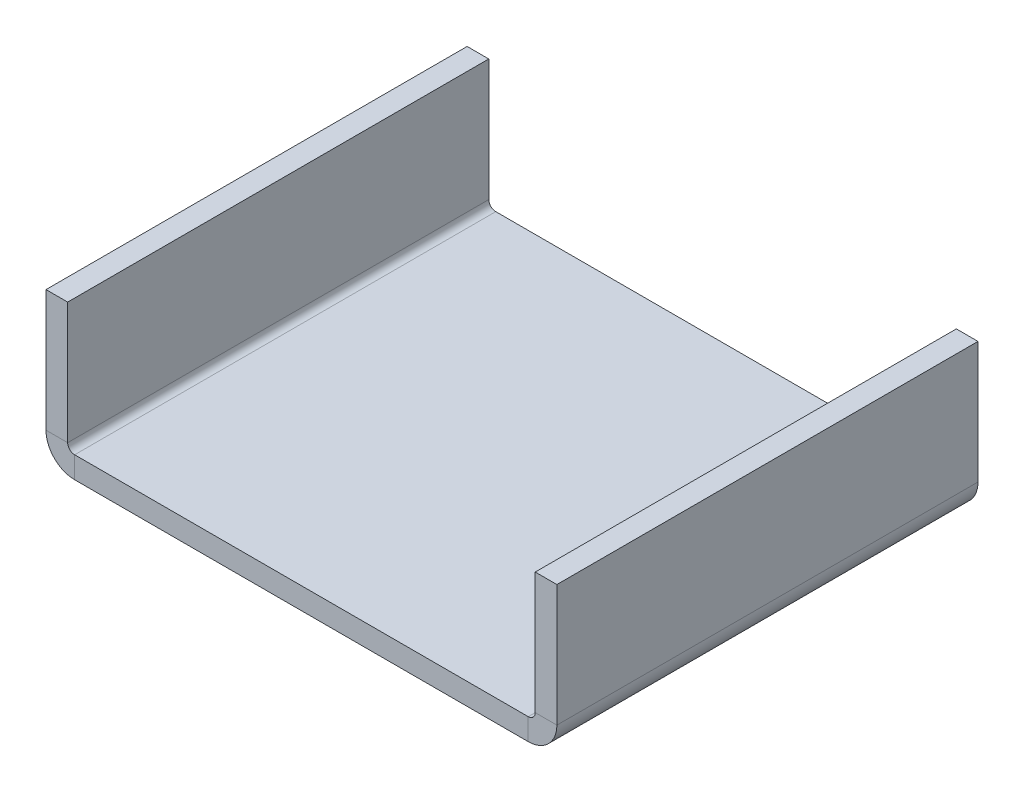
ISO-10303-21;
HEADER;
FILE_DESCRIPTION(('STEP AP214'),'2;1');
FILE_NAME('part.step','',(''),(''),'','','');
FILE_SCHEMA(('AUTOMOTIVE_DESIGN { 1 0 10303 214 1 1 1 1 }'));
ENDSEC;
DATA;
#1=APPLICATION_CONTEXT('core data for automotive mechanical design processes');
#2=APPLICATION_PROTOCOL_DEFINITION('international standard','automotive_design',2000,#1);
#3=PRODUCT_CONTEXT('',#1,'mechanical');
#4=PRODUCT('Part','Part','',(#3));
#5=PRODUCT_RELATED_PRODUCT_CATEGORY('part','',(#4));
#6=PRODUCT_DEFINITION_FORMATION('','',#4);
#7=PRODUCT_DEFINITION_CONTEXT('part definition',#1,'design');
#8=PRODUCT_DEFINITION('design','',#6,#7);
#9=PRODUCT_DEFINITION_SHAPE('','',#8);
#10=(LENGTH_UNIT() NAMED_UNIT(*) SI_UNIT(.MILLI.,.METRE.));
#11=(NAMED_UNIT(*) PLANE_ANGLE_UNIT() SI_UNIT($,.RADIAN.));
#12=(NAMED_UNIT(*) SI_UNIT($,.STERADIAN.) SOLID_ANGLE_UNIT());
#13=UNCERTAINTY_MEASURE_WITH_UNIT(LENGTH_MEASURE(1.E-05),#10,'distance_accuracy_value','');
#14=(GEOMETRIC_REPRESENTATION_CONTEXT(3) GLOBAL_UNCERTAINTY_ASSIGNED_CONTEXT((#13)) GLOBAL_UNIT_ASSIGNED_CONTEXT((#10,
#11,#12)) REPRESENTATION_CONTEXT('',''));
#15=CARTESIAN_POINT('',(0.,0.,0.));
#16=DIRECTION('',(0.,0.,1.));
#17=DIRECTION('',(1.,0.,0.));
#18=AXIS2_PLACEMENT_3D('',#15,#16,#17);
#19=CARTESIAN_POINT('',(0.,-2.286,0.));
#20=DIRECTION('',(0.,-1.,0.));
#21=DIRECTION('',(0.,0.,-1.));
#22=AXIS2_PLACEMENT_3D('',#19,#20,#21);
#23=PLANE('',#22);
#24=DIRECTION('',(-1.,0.,0.));
#25=VECTOR('',#24,1.);
#26=CARTESIAN_POINT('',(-26.9621,-2.286,-22.225));
#27=LINE('',#26,#25);
#28=CARTESIAN_POINT('',(23.9395,-2.286,-22.225));
#29=VERTEX_POINT('',#28);
#30=CARTESIAN_POINT('',(-23.9395,-2.286,-22.225));
#31=VERTEX_POINT('',#30);
#32=EDGE_CURVE('E90',#29,#31,#27,.T.);
#33=ORIENTED_EDGE('',*,*,#32,.F.);
#34=DIRECTION('',(0.,0.,-1.));
#35=VECTOR('',#34,1.);
#36=CARTESIAN_POINT('',(23.9395,-2.286,-22.225));
#37=LINE('',#36,#35);
#38=CARTESIAN_POINT('',(23.9395,-2.286,22.225));
#39=VERTEX_POINT('',#38);
#40=EDGE_CURVE('E213',#29,#39,#37,.F.);
#41=ORIENTED_EDGE('',*,*,#40,.T.);
#42=DIRECTION('',(1.,0.,0.));
#43=VECTOR('',#42,1.);
#44=CARTESIAN_POINT('',(-26.9621,-2.286,22.225));
#45=LINE('',#44,#43);
#46=CARTESIAN_POINT('',(-23.9395,-2.286,22.225));
#47=VERTEX_POINT('',#46);
#48=EDGE_CURVE('E13',#47,#39,#45,.T.);
#49=ORIENTED_EDGE('',*,*,#48,.F.);
#50=DIRECTION('',(0.,0.,1.));
#51=VECTOR('',#50,1.);
#52=CARTESIAN_POINT('',(-23.9395,-2.286,22.225));
#53=LINE('',#52,#51);
#54=EDGE_CURVE('E264',#47,#31,#53,.F.);
#55=ORIENTED_EDGE('',*,*,#54,.T.);
#56=EDGE_LOOP('',(#33,#41,#49,#55));
#57=FACE_BOUND('',#56,.T.);
#58=ADVANCED_FACE('F81',(#57),#23,.T.);
#59=CARTESIAN_POINT('',(0.,0.,0.));
#60=DIRECTION('',(0.,-1.,0.));
#61=DIRECTION('',(0.,0.,-1.));
#62=AXIS2_PLACEMENT_3D('',#59,#60,#61);
#63=PLANE('',#62);
#64=DIRECTION('',(0.,0.,-1.));
#65=VECTOR('',#64,1.);
#66=CARTESIAN_POINT('',(23.9395,0.,-22.225));
#67=LINE('',#66,#65);
#68=CARTESIAN_POINT('',(23.9395,0.,-22.225));
#69=VERTEX_POINT('',#68);
#70=CARTESIAN_POINT('',(23.9395,0.,22.225));
#71=VERTEX_POINT('',#70);
#72=EDGE_CURVE('E224',#69,#71,#67,.F.);
#73=ORIENTED_EDGE('',*,*,#72,.F.);
#74=DIRECTION('',(-1.,0.,0.));
#75=VECTOR('',#74,1.);
#76=CARTESIAN_POINT('',(-26.9621,0.,-22.225));
#77=LINE('',#76,#75);
#78=CARTESIAN_POINT('',(-23.9395,0.,-22.225));
#79=VERTEX_POINT('',#78);
#80=EDGE_CURVE('E281',#69,#79,#77,.T.);
#81=ORIENTED_EDGE('',*,*,#80,.T.);
#82=DIRECTION('',(0.,0.,1.));
#83=VECTOR('',#82,1.);
#84=CARTESIAN_POINT('',(-23.9395,0.,22.225));
#85=LINE('',#84,#83);
#86=CARTESIAN_POINT('',(-23.9395,0.,22.225));
#87=VERTEX_POINT('',#86);
#88=EDGE_CURVE('E275',#87,#79,#85,.F.);
#89=ORIENTED_EDGE('',*,*,#88,.F.);
#90=DIRECTION('',(1.,0.,0.));
#91=VECTOR('',#90,1.);
#92=CARTESIAN_POINT('',(-26.9621,0.,22.225));
#93=LINE('',#92,#91);
#94=EDGE_CURVE('E85',#87,#71,#93,.T.);
#95=ORIENTED_EDGE('',*,*,#94,.T.);
#96=EDGE_LOOP('',(#73,#81,#89,#95));
#97=FACE_BOUND('',#96,.T.);
#98=ADVANCED_FACE('F293',(#97),#63,.F.);
#99=CARTESIAN_POINT('',(-26.9621,-2.286,-22.225));
#100=DIRECTION('',(0.,0.,-1.));
#101=DIRECTION('',(-1.,0.,0.));
#102=AXIS2_PLACEMENT_3D('',#99,#100,#101);
#103=PLANE('',#102);
#104=ORIENTED_EDGE('',*,*,#80,.F.);
#105=DIRECTION('',(0.,-1.,0.));
#106=VECTOR('',#105,1.);
#107=CARTESIAN_POINT('',(23.9395,0.,-22.225));
#108=LINE('',#107,#106);
#109=EDGE_CURVE('E218',#69,#29,#108,.T.);
#110=ORIENTED_EDGE('',*,*,#109,.T.);
#111=ORIENTED_EDGE('',*,*,#32,.T.);
#112=DIRECTION('',(0.,-1.,0.));
#113=VECTOR('',#112,1.);
#114=CARTESIAN_POINT('',(-23.9395,0.,-22.225));
#115=LINE('',#114,#113);
#116=EDGE_CURVE('E279',#79,#31,#115,.T.);
#117=ORIENTED_EDGE('',*,*,#116,.F.);
#118=EDGE_LOOP('',(#104,#110,#111,#117));
#119=FACE_BOUND('',#118,.T.);
#120=ADVANCED_FACE('F83',(#119),#103,.T.);
#121=CARTESIAN_POINT('',(-26.9621,-2.286,22.225));
#122=DIRECTION('',(0.,0.,1.));
#123=DIRECTION('',(1.,0.,0.));
#124=AXIS2_PLACEMENT_3D('',#121,#122,#123);
#125=PLANE('',#124);
#126=DIRECTION('',(0.,-1.,0.));
#127=VECTOR('',#126,1.);
#128=CARTESIAN_POINT('',(23.9395,0.,22.225));
#129=LINE('',#128,#127);
#130=EDGE_CURVE('E229',#71,#39,#129,.T.);
#131=ORIENTED_EDGE('',*,*,#130,.F.);
#132=ORIENTED_EDGE('',*,*,#94,.F.);
#133=DIRECTION('',(0.,-1.,0.));
#134=VECTOR('',#133,1.);
#135=CARTESIAN_POINT('',(-23.9395,0.,22.225));
#136=LINE('',#135,#134);
#137=EDGE_CURVE('E269',#87,#47,#136,.T.);
#138=ORIENTED_EDGE('',*,*,#137,.T.);
#139=ORIENTED_EDGE('',*,*,#48,.T.);
#140=EDGE_LOOP('',(#131,#132,#138,#139));
#141=FACE_BOUND('',#140,.T.);
#142=ADVANCED_FACE('F296',(#141),#125,.T.);
#143=CARTESIAN_POINT('',(-23.9395,0.7366,-22.225));
#144=DIRECTION('',(0.,0.,-1.));
#145=DIRECTION('',(-1.,0.,0.));
#146=AXIS2_PLACEMENT_3D('',#143,#144,#145);
#147=PLANE('',#146);
#148=DIRECTION('',(1.,0.,0.));
#149=VECTOR('',#148,1.);
#150=CARTESIAN_POINT('',(-26.9621,0.736599999999989,-22.225));
#151=LINE('',#150,#149);
#152=CARTESIAN_POINT('',(-24.6761,0.736599999999997,-22.225));
#153=VERTEX_POINT('',#152);
#154=CARTESIAN_POINT('',(-26.9621,0.736599999999989,-22.225));
#155=VERTEX_POINT('',#154);
#156=EDGE_CURVE('E231',#153,#155,#151,.F.);
#157=ORIENTED_EDGE('',*,*,#156,.F.);
#158=CARTESIAN_POINT('',(-23.9395,0.7366,-22.225));
#159=DIRECTION('',(0.,0.,1.));
#160=DIRECTION('',(1.,0.,0.));
#161=AXIS2_PLACEMENT_3D('',#158,#159,#160);
#162=CIRCLE('',#161,0.7366);
#163=EDGE_CURVE('E272',#79,#153,#162,.F.);
#164=ORIENTED_EDGE('',*,*,#163,.F.);
#165=ORIENTED_EDGE('',*,*,#116,.T.);
#166=CARTESIAN_POINT('',(-23.9395,0.7366,-22.225));
#167=DIRECTION('',(0.,0.,1.));
#168=DIRECTION('',(1.,0.,0.));
#169=AXIS2_PLACEMENT_3D('',#166,#167,#168);
#170=CIRCLE('',#169,3.0226);
#171=EDGE_CURVE('E98',#31,#155,#170,.F.);
#172=ORIENTED_EDGE('',*,*,#171,.T.);
#173=EDGE_LOOP('',(#157,#164,#165,#172));
#174=FACE_BOUND('',#173,.T.);
#175=ADVANCED_FACE('F311',(#174),#147,.T.);
#176=CARTESIAN_POINT('',(-23.9395,0.7366,22.225));
#177=DIRECTION('',(0.,0.,-1.));
#178=DIRECTION('',(-1.,0.,0.));
#179=AXIS2_PLACEMENT_3D('',#176,#177,#178);
#180=PLANE('',#179);
#181=CARTESIAN_POINT('',(-23.9395,0.7366,22.225));
#182=DIRECTION('',(0.,0.,1.));
#183=DIRECTION('',(1.,0.,0.));
#184=AXIS2_PLACEMENT_3D('',#181,#182,#183);
#185=CIRCLE('',#184,0.7366);
#186=CARTESIAN_POINT('',(-24.6761,0.736599999999997,22.225));
#187=VERTEX_POINT('',#186);
#188=EDGE_CURVE('E237',#187,#87,#185,.T.);
#189=ORIENTED_EDGE('',*,*,#188,.F.);
#190=DIRECTION('',(1.,0.,0.));
#191=VECTOR('',#190,1.);
#192=CARTESIAN_POINT('',(-24.6761,0.736599999999997,22.225));
#193=LINE('',#192,#191);
#194=CARTESIAN_POINT('',(-26.9621,0.736599999999989,22.225));
#195=VERTEX_POINT('',#194);
#196=EDGE_CURVE('E257',#187,#195,#193,.F.);
#197=ORIENTED_EDGE('',*,*,#196,.T.);
#198=CARTESIAN_POINT('',(-23.9395,0.7366,22.225));
#199=DIRECTION('',(0.,0.,1.));
#200=DIRECTION('',(1.,0.,0.));
#201=AXIS2_PLACEMENT_3D('',#198,#199,#200);
#202=CIRCLE('',#201,3.0226);
#203=EDGE_CURVE('E267',#195,#47,#202,.T.);
#204=ORIENTED_EDGE('',*,*,#203,.T.);
#205=ORIENTED_EDGE('',*,*,#137,.F.);
#206=EDGE_LOOP('',(#189,#197,#204,#205));
#207=FACE_BOUND('',#206,.T.);
#208=ADVANCED_FACE('F335',(#207),#180,.F.);
#209=CARTESIAN_POINT('',(-23.9395,0.7366,22.225));
#210=DIRECTION('',(0.,0.,1.));
#211=DIRECTION('',(-1.,0.,0.));
#212=AXIS2_PLACEMENT_3D('',#209,#210,#211);
#213=CYLINDRICAL_SURFACE('',#212,3.0226);
#214=ORIENTED_EDGE('',*,*,#54,.F.);
#215=ORIENTED_EDGE('',*,*,#203,.F.);
#216=DIRECTION('',(0.,0.,1.));
#217=VECTOR('',#216,1.);
#218=CARTESIAN_POINT('',(-26.9621,0.736599999999989,-22.225));
#219=LINE('',#218,#217);
#220=EDGE_CURVE('E255',#195,#155,#219,.F.);
#221=ORIENTED_EDGE('',*,*,#220,.T.);
#222=ORIENTED_EDGE('',*,*,#171,.F.);
#223=EDGE_LOOP('',(#214,#215,#221,#222));
#224=FACE_BOUND('',#223,.T.);
#225=ADVANCED_FACE('F338',(#224),#213,.T.);
#226=CARTESIAN_POINT('',(-23.9395,0.7366,22.225));
#227=DIRECTION('',(0.,0.,1.));
#228=DIRECTION('',(-1.,0.,0.));
#229=AXIS2_PLACEMENT_3D('',#226,#227,#228);
#230=CYLINDRICAL_SURFACE('',#229,0.7366);
#231=ORIENTED_EDGE('',*,*,#88,.T.);
#232=ORIENTED_EDGE('',*,*,#163,.T.);
#233=DIRECTION('',(0.,0.,1.));
#234=VECTOR('',#233,1.);
#235=CARTESIAN_POINT('',(-24.6761,0.736599999999997,-22.225));
#236=LINE('',#235,#234);
#237=EDGE_CURVE('E260',#153,#187,#236,.T.);
#238=ORIENTED_EDGE('',*,*,#237,.T.);
#239=ORIENTED_EDGE('',*,*,#188,.T.);
#240=EDGE_LOOP('',(#231,#232,#238,#239));
#241=FACE_BOUND('',#240,.T.);
#242=ADVANCED_FACE('F314',(#241),#230,.F.);
#243=CARTESIAN_POINT('',(-26.9621000000001,13.589,22.225));
#244=DIRECTION('',(0.,0.,-1.));
#245=DIRECTION('',(0.,1.,0.));
#246=AXIS2_PLACEMENT_3D('',#243,#244,#245);
#247=PLANE('',#246);
#248=ORIENTED_EDGE('',*,*,#196,.F.);
#249=DIRECTION('',(0.,-1.,0.));
#250=VECTOR('',#249,1.);
#251=CARTESIAN_POINT('',(-24.6761000000001,13.589,22.225));
#252=LINE('',#251,#250);
#253=CARTESIAN_POINT('',(-24.6761000000001,13.589,22.225));
#254=VERTEX_POINT('',#253);
#255=EDGE_CURVE('E253',#187,#254,#252,.F.);
#256=ORIENTED_EDGE('',*,*,#255,.T.);
#257=DIRECTION('',(1.,0.,0.));
#258=VECTOR('',#257,1.);
#259=CARTESIAN_POINT('',(-26.9621000000001,13.589,22.225));
#260=LINE('',#259,#258);
#261=CARTESIAN_POINT('',(-26.9621000000001,13.589,22.225));
#262=VERTEX_POINT('',#261);
#263=EDGE_CURVE('E234',#262,#254,#260,.T.);
#264=ORIENTED_EDGE('',*,*,#263,.F.);
#265=DIRECTION('',(0.,1.,0.));
#266=VECTOR('',#265,1.);
#267=CARTESIAN_POINT('',(-26.9621,0.,22.225));
#268=LINE('',#267,#266);
#269=EDGE_CURVE('E246',#195,#262,#268,.T.);
#270=ORIENTED_EDGE('',*,*,#269,.F.);
#271=EDGE_LOOP('',(#248,#256,#264,#270));
#272=FACE_BOUND('',#271,.T.);
#273=ADVANCED_FACE('F332',(#272),#247,.F.);
#274=CARTESIAN_POINT('',(-26.9621,0.,-22.225));
#275=DIRECTION('',(0.,0.,1.));
#276=DIRECTION('',(1.,0.,0.));
#277=AXIS2_PLACEMENT_3D('',#274,#275,#276);
#278=PLANE('',#277);
#279=ORIENTED_EDGE('',*,*,#156,.T.);
#280=DIRECTION('',(0.,-1.,0.));
#281=VECTOR('',#280,1.);
#282=CARTESIAN_POINT('',(-26.9621,-1.04354332234021E-13,-22.225));
#283=LINE('',#282,#281);
#284=CARTESIAN_POINT('',(-26.9621000000001,13.589,-22.225));
#285=VERTEX_POINT('',#284);
#286=EDGE_CURVE('E241',#285,#155,#283,.T.);
#287=ORIENTED_EDGE('',*,*,#286,.F.);
#288=DIRECTION('',(1.,0.,0.));
#289=VECTOR('',#288,1.);
#290=CARTESIAN_POINT('',(-26.9621000000001,13.589,-22.225));
#291=LINE('',#290,#289);
#292=CARTESIAN_POINT('',(-24.6761000000001,13.589,-22.225));
#293=VERTEX_POINT('',#292);
#294=EDGE_CURVE('E238',#285,#293,#291,.T.);
#295=ORIENTED_EDGE('',*,*,#294,.T.);
#296=DIRECTION('',(0.,1.,0.));
#297=VECTOR('',#296,1.);
#298=CARTESIAN_POINT('',(-24.6761,0.,-22.225));
#299=LINE('',#298,#297);
#300=EDGE_CURVE('E248',#293,#153,#299,.F.);
#301=ORIENTED_EDGE('',*,*,#300,.T.);
#302=EDGE_LOOP('',(#279,#287,#295,#301));
#303=FACE_BOUND('',#302,.T.);
#304=ADVANCED_FACE('F322',(#303),#278,.F.);
#305=CARTESIAN_POINT('',(-26.9621,-1.04354332234021E-13,0.));
#306=DIRECTION('',(1.,0.,0.));
#307=DIRECTION('',(0.,1.,0.));
#308=AXIS2_PLACEMENT_3D('',#305,#306,#307);
#309=PLANE('',#308);
#310=ORIENTED_EDGE('',*,*,#220,.F.);
#311=ORIENTED_EDGE('',*,*,#269,.T.);
#312=DIRECTION('',(0.,0.,-1.));
#313=VECTOR('',#312,1.);
#314=CARTESIAN_POINT('',(-26.9621000000001,13.589,0.));
#315=LINE('',#314,#313);
#316=EDGE_CURVE('E244',#262,#285,#315,.T.);
#317=ORIENTED_EDGE('',*,*,#316,.T.);
#318=ORIENTED_EDGE('',*,*,#286,.T.);
#319=EDGE_LOOP('',(#310,#311,#317,#318));
#320=FACE_BOUND('',#319,.T.);
#321=ADVANCED_FACE('F337',(#320),#309,.F.);
#322=CARTESIAN_POINT('',(-24.6761,0.,0.));
#323=DIRECTION('',(1.,0.,0.));
#324=DIRECTION('',(0.,1.,0.));
#325=AXIS2_PLACEMENT_3D('',#322,#323,#324);
#326=PLANE('',#325);
#327=ORIENTED_EDGE('',*,*,#255,.F.);
#328=ORIENTED_EDGE('',*,*,#237,.F.);
#329=ORIENTED_EDGE('',*,*,#300,.F.);
#330=DIRECTION('',(0.,0.,1.));
#331=VECTOR('',#330,1.);
#332=CARTESIAN_POINT('',(-24.6761000000001,13.589,-22.225));
#333=LINE('',#332,#331);
#334=EDGE_CURVE('E251',#254,#293,#333,.F.);
#335=ORIENTED_EDGE('',*,*,#334,.F.);
#336=EDGE_LOOP('',(#327,#328,#329,#335));
#337=FACE_BOUND('',#336,.T.);
#338=ADVANCED_FACE('F319',(#337),#326,.T.);
#339=CARTESIAN_POINT('',(-26.9621000000001,13.589,-22.225));
#340=DIRECTION('',(0.,-1.,0.));
#341=DIRECTION('',(1.,0.,0.));
#342=AXIS2_PLACEMENT_3D('',#339,#340,#341);
#343=PLANE('',#342);
#344=ORIENTED_EDGE('',*,*,#334,.T.);
#345=ORIENTED_EDGE('',*,*,#294,.F.);
#346=ORIENTED_EDGE('',*,*,#316,.F.);
#347=ORIENTED_EDGE('',*,*,#263,.T.);
#348=EDGE_LOOP('',(#344,#345,#346,#347));
#349=FACE_BOUND('',#348,.T.);
#350=ADVANCED_FACE('F327',(#349),#343,.F.);
#351=CARTESIAN_POINT('',(23.9395,0.7366,22.225));
#352=DIRECTION('',(0.,0.,1.));
#353=DIRECTION('',(0.,-1.,0.));
#354=AXIS2_PLACEMENT_3D('',#351,#352,#353);
#355=PLANE('',#354);
#356=DIRECTION('',(-1.,0.,0.));
#357=VECTOR('',#356,1.);
#358=CARTESIAN_POINT('',(26.9621,0.736599999999989,22.225));
#359=LINE('',#358,#357);
#360=CARTESIAN_POINT('',(24.6761,0.736599999999997,22.225));
#361=VERTEX_POINT('',#360);
#362=CARTESIAN_POINT('',(26.9621,0.736599999999989,22.225));
#363=VERTEX_POINT('',#362);
#364=EDGE_CURVE('E196',#361,#363,#359,.F.);
#365=ORIENTED_EDGE('',*,*,#364,.F.);
#366=CARTESIAN_POINT('',(23.9395,0.7366,22.225));
#367=DIRECTION('',(0.,0.,-1.));
#368=DIRECTION('',(0.,1.,0.));
#369=AXIS2_PLACEMENT_3D('',#366,#367,#368);
#370=CIRCLE('',#369,0.7366);
#371=EDGE_CURVE('E221',#71,#361,#370,.F.);
#372=ORIENTED_EDGE('',*,*,#371,.F.);
#373=ORIENTED_EDGE('',*,*,#130,.T.);
#374=CARTESIAN_POINT('',(23.9395,0.7366,22.225));
#375=DIRECTION('',(0.,0.,-1.));
#376=DIRECTION('',(0.,1.,0.));
#377=AXIS2_PLACEMENT_3D('',#374,#375,#376);
#378=CIRCLE('',#377,3.0226);
#379=EDGE_CURVE('E106',#39,#363,#378,.F.);
#380=ORIENTED_EDGE('',*,*,#379,.T.);
#381=EDGE_LOOP('',(#365,#372,#373,#380));
#382=FACE_BOUND('',#381,.T.);
#383=ADVANCED_FACE('F300',(#382),#355,.T.);
#384=CARTESIAN_POINT('',(23.9395,0.736600000000003,-22.225));
#385=DIRECTION('',(0.,0.,1.));
#386=DIRECTION('',(0.,-1.,0.));
#387=AXIS2_PLACEMENT_3D('',#384,#385,#386);
#388=PLANE('',#387);
#389=CARTESIAN_POINT('',(23.9395,0.736600000000003,-22.225));
#390=DIRECTION('',(0.,0.,-1.));
#391=DIRECTION('',(0.,1.,0.));
#392=AXIS2_PLACEMENT_3D('',#389,#390,#391);
#393=CIRCLE('',#392,0.7366);
#394=CARTESIAN_POINT('',(24.6761,0.7366,-22.225));
#395=VERTEX_POINT('',#394);
#396=EDGE_CURVE('E226',#395,#69,#393,.T.);
#397=ORIENTED_EDGE('',*,*,#396,.F.);
#398=DIRECTION('',(-1.,0.,0.));
#399=VECTOR('',#398,1.);
#400=CARTESIAN_POINT('',(24.6761,0.7366,-22.225));
#401=LINE('',#400,#399);
#402=CARTESIAN_POINT('',(26.9621,0.736599999999992,-22.225));
#403=VERTEX_POINT('',#402);
#404=EDGE_CURVE('E207',#395,#403,#401,.F.);
#405=ORIENTED_EDGE('',*,*,#404,.T.);
#406=CARTESIAN_POINT('',(23.9395,0.736600000000003,-22.225));
#407=DIRECTION('',(0.,0.,-1.));
#408=DIRECTION('',(0.,1.,0.));
#409=AXIS2_PLACEMENT_3D('',#406,#407,#408);
#410=CIRCLE('',#409,3.0226);
#411=EDGE_CURVE('E216',#403,#29,#410,.T.);
#412=ORIENTED_EDGE('',*,*,#411,.T.);
#413=ORIENTED_EDGE('',*,*,#109,.F.);
#414=EDGE_LOOP('',(#397,#405,#412,#413));
#415=FACE_BOUND('',#414,.T.);
#416=ADVANCED_FACE('F306',(#415),#388,.F.);
#417=CARTESIAN_POINT('',(23.9395,0.736600000000003,-22.225));
#418=DIRECTION('',(0.,0.,-1.));
#419=DIRECTION('',(1.,0.,0.));
#420=AXIS2_PLACEMENT_3D('',#417,#418,#419);
#421=CYLINDRICAL_SURFACE('',#420,3.0226);
#422=ORIENTED_EDGE('',*,*,#40,.F.);
#423=ORIENTED_EDGE('',*,*,#411,.F.);
#424=DIRECTION('',(0.,0.,-1.));
#425=VECTOR('',#424,1.);
#426=CARTESIAN_POINT('',(26.9621,0.736599999999989,22.225));
#427=LINE('',#426,#425);
#428=EDGE_CURVE('E205',#403,#363,#427,.F.);
#429=ORIENTED_EDGE('',*,*,#428,.T.);
#430=ORIENTED_EDGE('',*,*,#379,.F.);
#431=EDGE_LOOP('',(#422,#423,#429,#430));
#432=FACE_BOUND('',#431,.T.);
#433=ADVANCED_FACE('F303',(#432),#421,.T.);
#434=CARTESIAN_POINT('',(23.9395,0.736600000000003,-22.225));
#435=DIRECTION('',(0.,0.,-1.));
#436=DIRECTION('',(1.,0.,0.));
#437=AXIS2_PLACEMENT_3D('',#434,#435,#436);
#438=CYLINDRICAL_SURFACE('',#437,0.7366);
#439=ORIENTED_EDGE('',*,*,#72,.T.);
#440=ORIENTED_EDGE('',*,*,#371,.T.);
#441=DIRECTION('',(0.,0.,-1.));
#442=VECTOR('',#441,1.);
#443=CARTESIAN_POINT('',(24.6761,0.736599999999997,22.225));
#444=LINE('',#443,#442);
#445=EDGE_CURVE('E210',#361,#395,#444,.T.);
#446=ORIENTED_EDGE('',*,*,#445,.T.);
#447=ORIENTED_EDGE('',*,*,#396,.T.);
#448=EDGE_LOOP('',(#439,#440,#446,#447));
#449=FACE_BOUND('',#448,.T.);
#450=ADVANCED_FACE('F486',(#449),#438,.F.);
#451=CARTESIAN_POINT('',(26.9621,0.,22.225));
#452=DIRECTION('',(0.,0.,-1.));
#453=DIRECTION('',(-1.,0.,0.));
#454=AXIS2_PLACEMENT_3D('',#451,#452,#453);
#455=PLANE('',#454);
#456=ORIENTED_EDGE('',*,*,#364,.T.);
#457=DIRECTION('',(0.,-1.,0.));
#458=VECTOR('',#457,1.);
#459=CARTESIAN_POINT('',(26.9621,-1.04354332234021E-13,22.225));
#460=LINE('',#459,#458);
#461=CARTESIAN_POINT('',(26.9621000000001,13.589,22.225));
#462=VERTEX_POINT('',#461);
#463=EDGE_CURVE('E177',#462,#363,#460,.T.);
#464=ORIENTED_EDGE('',*,*,#463,.F.);
#465=DIRECTION('',(-1.,0.,0.));
#466=VECTOR('',#465,1.);
#467=CARTESIAN_POINT('',(26.9621000000001,13.589,22.225));
#468=LINE('',#467,#466);
#469=CARTESIAN_POINT('',(24.6761000000001,13.589,22.225));
#470=VERTEX_POINT('',#469);
#471=EDGE_CURVE('E183',#462,#470,#468,.T.);
#472=ORIENTED_EDGE('',*,*,#471,.T.);
#473=DIRECTION('',(0.,1.,0.));
#474=VECTOR('',#473,1.);
#475=CARTESIAN_POINT('',(24.6761,0.,22.225));
#476=LINE('',#475,#474);
#477=EDGE_CURVE('E203',#470,#361,#476,.F.);
#478=ORIENTED_EDGE('',*,*,#477,.T.);
#479=EDGE_LOOP('',(#456,#464,#472,#478));
#480=FACE_BOUND('',#479,.T.);
#481=ADVANCED_FACE('F195',(#480),#455,.F.);
#482=CARTESIAN_POINT('',(26.9621000000001,13.589,-22.225));
#483=DIRECTION('',(0.,0.,1.));
#484=DIRECTION('',(1.,0.,0.));
#485=AXIS2_PLACEMENT_3D('',#482,#483,#484);
#486=PLANE('',#485);
#487=ORIENTED_EDGE('',*,*,#404,.F.);
#488=DIRECTION('',(0.,-1.,0.));
#489=VECTOR('',#488,1.);
#490=CARTESIAN_POINT('',(24.6761000000001,13.589,-22.225));
#491=LINE('',#490,#489);
#492=CARTESIAN_POINT('',(24.6761000000001,13.589,-22.225));
#493=VERTEX_POINT('',#492);
#494=EDGE_CURVE('E199',#395,#493,#491,.F.);
#495=ORIENTED_EDGE('',*,*,#494,.T.);
#496=DIRECTION('',(-1.,0.,0.));
#497=VECTOR('',#496,1.);
#498=CARTESIAN_POINT('',(26.9621000000001,13.589,-22.225));
#499=LINE('',#498,#497);
#500=CARTESIAN_POINT('',(26.9621000000001,13.589,-22.225));
#501=VERTEX_POINT('',#500);
#502=EDGE_CURVE('E192',#501,#493,#499,.T.);
#503=ORIENTED_EDGE('',*,*,#502,.F.);
#504=DIRECTION('',(0.,1.,0.));
#505=VECTOR('',#504,1.);
#506=CARTESIAN_POINT('',(26.9621,-1.04354332234021E-13,-22.225));
#507=LINE('',#506,#505);
#508=EDGE_CURVE('E179',#403,#501,#507,.T.);
#509=ORIENTED_EDGE('',*,*,#508,.F.);
#510=EDGE_LOOP('',(#487,#495,#503,#509));
#511=FACE_BOUND('',#510,.T.);
#512=ADVANCED_FACE('F508',(#511),#486,.F.);
#513=CARTESIAN_POINT('',(26.9621,-1.04354332234021E-13,0.));
#514=DIRECTION('',(-1.,0.,0.));
#515=DIRECTION('',(0.,-1.,0.));
#516=AXIS2_PLACEMENT_3D('',#513,#514,#515);
#517=PLANE('',#516);
#518=ORIENTED_EDGE('',*,*,#428,.F.);
#519=ORIENTED_EDGE('',*,*,#508,.T.);
#520=DIRECTION('',(0.,0.,1.));
#521=VECTOR('',#520,1.);
#522=CARTESIAN_POINT('',(26.9621000000001,13.589,0.));
#523=LINE('',#522,#521);
#524=EDGE_CURVE('E172',#501,#462,#523,.T.);
#525=ORIENTED_EDGE('',*,*,#524,.T.);
#526=ORIENTED_EDGE('',*,*,#463,.T.);
#527=EDGE_LOOP('',(#518,#519,#525,#526));
#528=FACE_BOUND('',#527,.T.);
#529=ADVANCED_FACE('F175',(#528),#517,.F.);
#530=CARTESIAN_POINT('',(24.6761,0.,0.));
#531=DIRECTION('',(-1.,0.,0.));
#532=DIRECTION('',(0.,-1.,0.));
#533=AXIS2_PLACEMENT_3D('',#530,#531,#532);
#534=PLANE('',#533);
#535=ORIENTED_EDGE('',*,*,#494,.F.);
#536=ORIENTED_EDGE('',*,*,#445,.F.);
#537=ORIENTED_EDGE('',*,*,#477,.F.);
#538=DIRECTION('',(0.,0.,-1.));
#539=VECTOR('',#538,1.);
#540=CARTESIAN_POINT('',(24.6761000000001,13.589,22.225));
#541=LINE('',#540,#539);
#542=EDGE_CURVE('E188',#493,#470,#541,.F.);
#543=ORIENTED_EDGE('',*,*,#542,.F.);
#544=EDGE_LOOP('',(#535,#536,#537,#543));
#545=FACE_BOUND('',#544,.T.);
#546=ADVANCED_FACE('F530',(#545),#534,.T.);
#547=CARTESIAN_POINT('',(26.9621000000001,13.589,22.225));
#548=DIRECTION('',(0.,-1.,0.));
#549=DIRECTION('',(1.,0.,0.));
#550=AXIS2_PLACEMENT_3D('',#547,#548,#549);
#551=PLANE('',#550);
#552=ORIENTED_EDGE('',*,*,#542,.T.);
#553=ORIENTED_EDGE('',*,*,#471,.F.);
#554=ORIENTED_EDGE('',*,*,#524,.F.);
#555=ORIENTED_EDGE('',*,*,#502,.T.);
#556=EDGE_LOOP('',(#552,#553,#554,#555));
#557=FACE_BOUND('',#556,.T.);
#558=ADVANCED_FACE('F186',(#557),#551,.F.);
#559=CLOSED_SHELL('',(#58,#98,#120,#142,#175,#208,#225,#242,#273,#304,#321,#338,#350,#383,#416,
#433,#450,#481,#512,#529,#546,#558));
#560=MANIFOLD_SOLID_BREP('B2',#559);
#561=ADVANCED_BREP_SHAPE_REPRESENTATION('',(#18,#560),#14);
#562=SHAPE_DEFINITION_REPRESENTATION(#9,#561);
ENDSEC;
END-ISO-10303-21;
